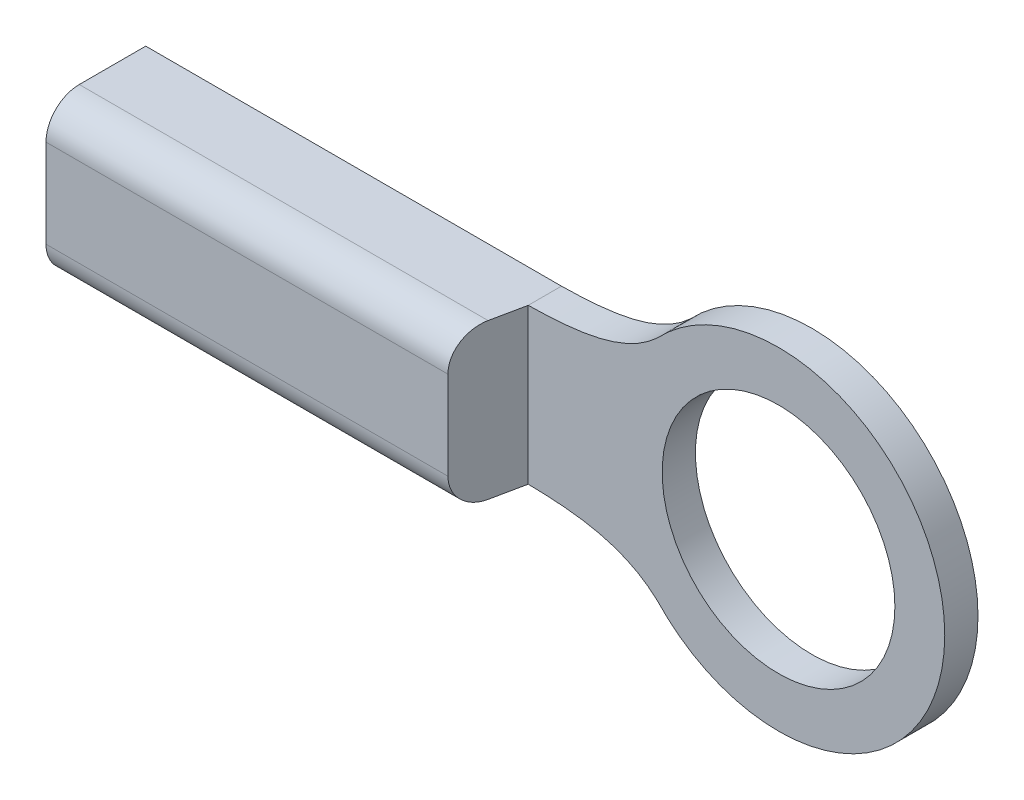
ISO-10303-21;
HEADER;
FILE_DESCRIPTION(('STEP AP214'),'2;1');
FILE_NAME('part.step','',(''),(''),'','','');
FILE_SCHEMA(('AUTOMOTIVE_DESIGN { 1 0 10303 214 1 1 1 1 }'));
ENDSEC;
DATA;
#1=APPLICATION_CONTEXT('core data for automotive mechanical design processes');
#2=APPLICATION_PROTOCOL_DEFINITION('international standard','automotive_design',2000,#1);
#3=PRODUCT_CONTEXT('',#1,'mechanical');
#4=PRODUCT('Part','Part','',(#3));
#5=PRODUCT_RELATED_PRODUCT_CATEGORY('part','',(#4));
#6=PRODUCT_DEFINITION_FORMATION('','',#4);
#7=PRODUCT_DEFINITION_CONTEXT('part definition',#1,'design');
#8=PRODUCT_DEFINITION('design','',#6,#7);
#9=PRODUCT_DEFINITION_SHAPE('','',#8);
#10=(LENGTH_UNIT() NAMED_UNIT(*) SI_UNIT(.MILLI.,.METRE.));
#11=(NAMED_UNIT(*) PLANE_ANGLE_UNIT() SI_UNIT($,.RADIAN.));
#12=(NAMED_UNIT(*) SI_UNIT($,.STERADIAN.) SOLID_ANGLE_UNIT());
#13=UNCERTAINTY_MEASURE_WITH_UNIT(LENGTH_MEASURE(1.E-05),#10,'distance_accuracy_value','');
#14=(GEOMETRIC_REPRESENTATION_CONTEXT(3) GLOBAL_UNCERTAINTY_ASSIGNED_CONTEXT((#13)) GLOBAL_UNIT_ASSIGNED_CONTEXT((#10,
#11,#12)) REPRESENTATION_CONTEXT('',''));
#15=CARTESIAN_POINT('',(0.,0.,0.));
#16=DIRECTION('',(0.,0.,1.));
#17=DIRECTION('',(1.,0.,0.));
#18=AXIS2_PLACEMENT_3D('',#15,#16,#17);
#19=CARTESIAN_POINT('',(0.,0.,0.5));
#20=DIRECTION('',(0.,0.,-1.));
#21=DIRECTION('',(-1.,0.,0.));
#22=AXIS2_PLACEMENT_3D('',#19,#20,#21);
#23=CYLINDRICAL_SURFACE('',#22,1.75);
#24=CARTESIAN_POINT('',(0.,0.,0.5));
#25=DIRECTION('',(0.,0.,1.));
#26=DIRECTION('',(1.,0.,0.));
#27=AXIS2_PLACEMENT_3D('',#24,#25,#26);
#28=CIRCLE('',#27,1.75);
#29=CARTESIAN_POINT('',(1.75,0.,0.5));
#30=VERTEX_POINT('',#29);
#31=EDGE_CURVE('E134',#30,#30,#28,.T.);
#32=ORIENTED_EDGE('',*,*,#31,.T.);
#33=EDGE_LOOP('',(#32));
#34=FACE_BOUND('',#33,.T.);
#35=CARTESIAN_POINT('',(0.,0.,0.));
#36=DIRECTION('',(0.,0.,1.));
#37=DIRECTION('',(1.,0.,0.));
#38=AXIS2_PLACEMENT_3D('',#35,#36,#37);
#39=CIRCLE('',#38,1.75);
#40=CARTESIAN_POINT('',(1.75,0.,0.));
#41=VERTEX_POINT('',#40);
#42=EDGE_CURVE('E148',#41,#41,#39,.T.);
#43=ORIENTED_EDGE('',*,*,#42,.F.);
#44=EDGE_LOOP('',(#43));
#45=FACE_BOUND('',#44,.T.);
#46=ADVANCED_FACE('F37',(#34,#45),#23,.F.);
#47=CARTESIAN_POINT('',(0.,0.,0.5));
#48=DIRECTION('',(0.,0.,-1.));
#49=DIRECTION('',(-1.,0.,0.));
#50=AXIS2_PLACEMENT_3D('',#47,#48,#49);
#51=CYLINDRICAL_SURFACE('',#50,2.5);
#52=CARTESIAN_POINT('',(0.,0.,0.5));
#53=DIRECTION('',(0.,0.,1.));
#54=DIRECTION('',(1.,0.,0.));
#55=AXIS2_PLACEMENT_3D('',#52,#53,#54);
#56=CIRCLE('',#55,2.5);
#57=CARTESIAN_POINT('',(-1.82422996137825,-1.70943998081533,0.5));
#58=VERTEX_POINT('',#57);
#59=CARTESIAN_POINT('',(-1.82422996137825,1.70943998081533,0.5));
#60=VERTEX_POINT('',#59);
#61=EDGE_CURVE('E116',#58,#60,#56,.T.);
#62=ORIENTED_EDGE('',*,*,#61,.F.);
#63=DIRECTION('',(0.,0.,-1.));
#64=VECTOR('',#63,1.);
#65=CARTESIAN_POINT('',(-1.82422996137825,-1.70943998081533,1.5));
#66=LINE('',#65,#64);
#67=CARTESIAN_POINT('',(-1.82422996137825,-1.70943998081533,0.));
#68=VERTEX_POINT('',#67);
#69=EDGE_CURVE('E129',#58,#68,#66,.T.);
#70=ORIENTED_EDGE('',*,*,#69,.T.);
#71=CARTESIAN_POINT('',(0.,0.,0.));
#72=DIRECTION('',(0.,0.,1.));
#73=DIRECTION('',(1.,0.,0.));
#74=AXIS2_PLACEMENT_3D('',#71,#72,#73);
#75=CIRCLE('',#74,2.5);
#76=CARTESIAN_POINT('',(-1.82422996137825,1.70943998081533,0.));
#77=VERTEX_POINT('',#76);
#78=EDGE_CURVE('E150',#68,#77,#75,.T.);
#79=ORIENTED_EDGE('',*,*,#78,.T.);
#80=DIRECTION('',(0.,0.,-1.));
#81=VECTOR('',#80,1.);
#82=CARTESIAN_POINT('',(-1.82422996137825,1.70943998081533,1.5));
#83=LINE('',#82,#81);
#84=EDGE_CURVE('E132',#60,#77,#83,.T.);
#85=ORIENTED_EDGE('',*,*,#84,.F.);
#86=EDGE_LOOP('',(#62,#70,#79,#85));
#87=FACE_BOUND('',#86,.T.);
#88=ADVANCED_FACE('F128',(#87),#51,.T.);
#89=CARTESIAN_POINT('',(0.,0.,0.5));
#90=DIRECTION('',(0.,0.,1.));
#91=DIRECTION('',(1.,0.,0.));
#92=AXIS2_PLACEMENT_3D('',#89,#90,#91);
#93=PLANE('',#92);
#94=ORIENTED_EDGE('',*,*,#61,.T.);
#95=CARTESIAN_POINT('',(-1.82422996137825,1.70943998081533,0.5));
#96=CARTESIAN_POINT('',(-2.34178439852012,1.22833040439289,0.5));
#97=CARTESIAN_POINT('',(-3.09851087389736,1.17900324339882,0.5));
#98=CARTESIAN_POINT('',(-3.76476193479,1.16483970754641,0.5));
#99=B_SPLINE_CURVE_WITH_KNOTS('',3,(#95,#96,#97,#98),.UNSPECIFIED.,.F.,.F.,(4,4),(0.,1.),.UNSPECIFIED.);
#100=CARTESIAN_POINT('',(-3.76476193479,1.16483970754641,0.5));
#101=VERTEX_POINT('',#100);
#102=EDGE_CURVE('E156',#101,#60,#99,.F.);
#103=ORIENTED_EDGE('',*,*,#102,.F.);
#104=DIRECTION('',(0.,1.,0.));
#105=VECTOR('',#104,1.);
#106=CARTESIAN_POINT('',(-3.76476193479,-2.5,0.5));
#107=LINE('',#106,#105);
#108=CARTESIAN_POINT('',(-3.76476193479,-1.16483970754641,0.5));
#109=VERTEX_POINT('',#108);
#110=EDGE_CURVE('E118',#109,#101,#107,.T.);
#111=ORIENTED_EDGE('',*,*,#110,.F.);
#112=CARTESIAN_POINT('',(-1.82422996137825,-1.70943998081533,0.5));
#113=CARTESIAN_POINT('',(-2.34178439852012,-1.22833040439289,0.5));
#114=CARTESIAN_POINT('',(-3.09851087389736,-1.17900324339882,0.5));
#115=CARTESIAN_POINT('',(-3.76476193479,-1.16483970754641,0.5));
#116=B_SPLINE_CURVE_WITH_KNOTS('',3,(#112,#113,#114,#115),.UNSPECIFIED.,.F.,.F.,(4,4),(0.,1.),.UNSPECIFIED.);
#117=EDGE_CURVE('E111',#109,#58,#116,.F.);
#118=ORIENTED_EDGE('',*,*,#117,.T.);
#119=EDGE_LOOP('',(#94,#103,#111,#118));
#120=FACE_BOUND('',#119,.T.);
#121=ORIENTED_EDGE('',*,*,#31,.F.);
#122=EDGE_LOOP('',(#121));
#123=FACE_BOUND('',#122,.T.);
#124=ADVANCED_FACE('F113',(#120,#123),#93,.T.);
#125=CARTESIAN_POINT('',(0.,0.,0.));
#126=DIRECTION('',(0.,0.,1.));
#127=DIRECTION('',(1.,0.,0.));
#128=AXIS2_PLACEMENT_3D('',#125,#126,#127);
#129=PLANE('',#128);
#130=ORIENTED_EDGE('',*,*,#42,.T.);
#131=EDGE_LOOP('',(#130));
#132=FACE_BOUND('',#131,.T.);
#133=ORIENTED_EDGE('',*,*,#78,.F.);
#134=CARTESIAN_POINT('',(-1.82422996137825,-1.70943998081533,0.));
#135=CARTESIAN_POINT('',(-2.34178439852012,-1.22833040439289,0.));
#136=CARTESIAN_POINT('',(-3.09851087389736,-1.17900324339882,0.));
#137=CARTESIAN_POINT('',(-3.76476193479,-1.16483970754641,0.));
#138=B_SPLINE_CURVE_WITH_KNOTS('',3,(#134,#135,#136,#137),.UNSPECIFIED.,.F.,.F.,(4,4),(0.,1.),.UNSPECIFIED.);
#139=CARTESIAN_POINT('',(-3.76476193479,-1.16483970754641,0.));
#140=VERTEX_POINT('',#139);
#141=EDGE_CURVE('E138',#68,#140,#138,.T.);
#142=ORIENTED_EDGE('',*,*,#141,.T.);
#143=DIRECTION('',(-1.,0.,0.));
#144=VECTOR('',#143,1.);
#145=CARTESIAN_POINT('',(0.,-1.16483970754641,0.));
#146=LINE('',#145,#144);
#147=CARTESIAN_POINT('',(-10.017195060379,-1.16483970754641,0.));
#148=VERTEX_POINT('',#147);
#149=EDGE_CURVE('E210',#140,#148,#146,.T.);
#150=ORIENTED_EDGE('',*,*,#149,.T.);
#151=DIRECTION('',(0.,-1.,0.));
#152=VECTOR('',#151,1.);
#153=CARTESIAN_POINT('',(-10.017195060379,0.,0.));
#154=LINE('',#153,#152);
#155=CARTESIAN_POINT('',(-10.017195060379,1.16483970754641,0.));
#156=VERTEX_POINT('',#155);
#157=EDGE_CURVE('E122',#156,#148,#154,.T.);
#158=ORIENTED_EDGE('',*,*,#157,.F.);
#159=DIRECTION('',(-1.,0.,0.));
#160=VECTOR('',#159,1.);
#161=CARTESIAN_POINT('',(0.,1.16483970754641,0.));
#162=LINE('',#161,#160);
#163=CARTESIAN_POINT('',(-3.76476193479,1.16483970754641,0.));
#164=VERTEX_POINT('',#163);
#165=EDGE_CURVE('E193',#164,#156,#162,.T.);
#166=ORIENTED_EDGE('',*,*,#165,.F.);
#167=CARTESIAN_POINT('',(-1.82422996137825,1.70943998081533,0.));
#168=CARTESIAN_POINT('',(-2.34178439852012,1.22833040439289,0.));
#169=CARTESIAN_POINT('',(-3.09851087389736,1.17900324339882,0.));
#170=CARTESIAN_POINT('',(-3.76476193479,1.16483970754641,0.));
#171=B_SPLINE_CURVE_WITH_KNOTS('',3,(#167,#168,#169,#170),.UNSPECIFIED.,.F.,.F.,(4,4),(0.,1.),.UNSPECIFIED.);
#172=EDGE_CURVE('E199',#77,#164,#171,.T.);
#173=ORIENTED_EDGE('',*,*,#172,.F.);
#174=EDGE_LOOP('',(#133,#142,#150,#158,#166,#173));
#175=FACE_BOUND('',#174,.T.);
#176=ADVANCED_FACE('F242',(#132,#175),#129,.F.);
#177=CARTESIAN_POINT('',(-10.017195060379,0.,1.5));
#178=DIRECTION('',(1.,0.,0.));
#179=DIRECTION('',(0.,0.,-1.));
#180=AXIS2_PLACEMENT_3D('',#177,#178,#179);
#181=PLANE('',#180);
#182=CARTESIAN_POINT('',(-10.017195060379,0.,0.793196725410894));
#183=DIRECTION('',(-1.,0.,0.));
#184=DIRECTION('',(0.,0.,1.));
#185=AXIS2_PLACEMENT_3D('',#182,#183,#184);
#186=CIRCLE('',#185,0.557530811457596);
#187=CARTESIAN_POINT('',(-10.017195060379,0.,1.35072753686849));
#188=VERTEX_POINT('',#187);
#189=EDGE_CURVE('E276',#188,#188,#186,.T.);
#190=ORIENTED_EDGE('',*,*,#189,.F.);
#191=EDGE_LOOP('',(#190));
#192=FACE_BOUND('',#191,.T.);
#193=DIRECTION('',(0.,-1.,0.));
#194=VECTOR('',#193,1.);
#195=CARTESIAN_POINT('',(-10.017195060379,0.,1.5));
#196=LINE('',#195,#194);
#197=CARTESIAN_POINT('',(-10.017195060379,0.664839707546408,1.5));
#198=VERTEX_POINT('',#197);
#199=CARTESIAN_POINT('',(-10.017195060379,-0.664839707546408,1.5));
#200=VERTEX_POINT('',#199);
#201=EDGE_CURVE('E190',#198,#200,#196,.T.);
#202=ORIENTED_EDGE('',*,*,#201,.F.);
#203=CARTESIAN_POINT('',(-10.017195060379,0.664839707546408,1.));
#204=DIRECTION('',(1.,0.,0.));
#205=DIRECTION('',(0.,0.,-1.));
#206=AXIS2_PLACEMENT_3D('',#203,#204,#205);
#207=CIRCLE('',#206,0.5);
#208=CARTESIAN_POINT('',(-10.017195060379,1.16483970754641,1.));
#209=VERTEX_POINT('',#208);
#210=EDGE_CURVE('E170',#198,#209,#207,.F.);
#211=ORIENTED_EDGE('',*,*,#210,.T.);
#212=DIRECTION('',(0.,0.,-1.));
#213=VECTOR('',#212,1.);
#214=CARTESIAN_POINT('',(-10.017195060379,1.16483970754641,1.5));
#215=LINE('',#214,#213);
#216=EDGE_CURVE('E188',#209,#156,#215,.T.);
#217=ORIENTED_EDGE('',*,*,#216,.T.);
#218=ORIENTED_EDGE('',*,*,#157,.T.);
#219=DIRECTION('',(0.,0.,-1.));
#220=VECTOR('',#219,1.);
#221=CARTESIAN_POINT('',(-10.017195060379,-1.16483970754641,1.5));
#222=LINE('',#221,#220);
#223=CARTESIAN_POINT('',(-10.017195060379,-1.16483970754641,1.));
#224=VERTEX_POINT('',#223);
#225=EDGE_CURVE('E141',#224,#148,#222,.T.);
#226=ORIENTED_EDGE('',*,*,#225,.F.);
#227=CARTESIAN_POINT('',(-10.017195060379,-0.664839707546408,1.));
#228=DIRECTION('',(1.,0.,0.));
#229=DIRECTION('',(0.,0.,-1.));
#230=AXIS2_PLACEMENT_3D('',#227,#228,#229);
#231=CIRCLE('',#230,0.5);
#232=EDGE_CURVE('E168',#224,#200,#231,.F.);
#233=ORIENTED_EDGE('',*,*,#232,.T.);
#234=EDGE_LOOP('',(#202,#211,#217,#218,#226,#233));
#235=FACE_BOUND('',#234,.T.);
#236=ADVANCED_FACE('F186',(#192,#235),#181,.F.);
#237=CARTESIAN_POINT('',(0.,-1.16483970754641,1.5));
#238=DIRECTION('',(0.,-1.,0.));
#239=DIRECTION('',(0.,0.,-1.));
#240=AXIS2_PLACEMENT_3D('',#237,#238,#239);
#241=PLANE('',#240);
#242=DIRECTION('',(0.202718340541204,0.,-0.979237087945621));
#243=VECTOR('',#242,1.);
#244=CARTESIAN_POINT('',(-3.80855939362616,-1.16483970754641,0.711564952315833));
#245=LINE('',#244,#243);
#246=CARTESIAN_POINT('',(-3.86827023887522,-1.16483970754641,1.));
#247=VERTEX_POINT('',#246);
#248=EDGE_CURVE('E123',#247,#109,#245,.T.);
#249=ORIENTED_EDGE('',*,*,#248,.F.);
#250=DIRECTION('',(-1.,0.,0.));
#251=VECTOR('',#250,1.);
#252=CARTESIAN_POINT('',(0.,-1.16483970754641,1.));
#253=LINE('',#252,#251);
#254=EDGE_CURVE('E11',#247,#224,#253,.T.);
#255=ORIENTED_EDGE('',*,*,#254,.T.);
#256=ORIENTED_EDGE('',*,*,#225,.T.);
#257=ORIENTED_EDGE('',*,*,#149,.F.);
#258=DIRECTION('',(0.,0.,-1.));
#259=VECTOR('',#258,1.);
#260=CARTESIAN_POINT('',(-3.76476193479,-1.16483970754641,1.5));
#261=LINE('',#260,#259);
#262=EDGE_CURVE('E139',#109,#140,#261,.T.);
#263=ORIENTED_EDGE('',*,*,#262,.F.);
#264=EDGE_LOOP('',(#249,#255,#256,#257,#263));
#265=FACE_BOUND('',#264,.T.);
#266=ADVANCED_FACE('F236',(#265),#241,.T.);
#267=CARTESIAN_POINT('',(-1.82422996137825,-1.70943998081533,1.5));
#268=CARTESIAN_POINT('',(-2.34178439852012,-1.22833040439289,1.5));
#269=CARTESIAN_POINT('',(-3.09851087389736,-1.17900324339882,1.5));
#270=CARTESIAN_POINT('',(-3.76476193479,-1.16483970754641,1.5));
#271=B_SPLINE_CURVE_WITH_KNOTS('',3,(#267,#268,#269,#270),.UNSPECIFIED.,.F.,.F.,(4,4),(0.,1.),.UNSPECIFIED.);
#272=DIRECTION('',(0.,0.,-1.));
#273=VECTOR('',#272,1.);
#274=SURFACE_OF_LINEAR_EXTRUSION('',#271,#273);
#275=ORIENTED_EDGE('',*,*,#117,.F.);
#276=ORIENTED_EDGE('',*,*,#262,.T.);
#277=ORIENTED_EDGE('',*,*,#141,.F.);
#278=ORIENTED_EDGE('',*,*,#69,.F.);
#279=EDGE_LOOP('',(#275,#276,#277,#278));
#280=FACE_BOUND('',#279,.T.);
#281=ADVANCED_FACE('F136',(#280),#274,.T.);
#282=CARTESIAN_POINT('',(-1.82422996137825,1.70943998081533,1.5));
#283=CARTESIAN_POINT('',(-2.34178439852012,1.22833040439289,1.5));
#284=CARTESIAN_POINT('',(-3.09851087389736,1.17900324339882,1.5));
#285=CARTESIAN_POINT('',(-3.76476193479,1.16483970754641,1.5));
#286=B_SPLINE_CURVE_WITH_KNOTS('',3,(#282,#283,#284,#285),.UNSPECIFIED.,.F.,.F.,(4,4),(0.,1.),.UNSPECIFIED.);
#287=DIRECTION('',(0.,0.,-1.));
#288=VECTOR('',#287,1.);
#289=SURFACE_OF_LINEAR_EXTRUSION('',#286,#288);
#290=DIRECTION('',(0.,0.,-1.));
#291=VECTOR('',#290,1.);
#292=CARTESIAN_POINT('',(-3.76476193479,1.16483970754641,1.5));
#293=LINE('',#292,#291);
#294=EDGE_CURVE('E143',#101,#164,#293,.T.);
#295=ORIENTED_EDGE('',*,*,#294,.F.);
#296=ORIENTED_EDGE('',*,*,#102,.T.);
#297=ORIENTED_EDGE('',*,*,#84,.T.);
#298=ORIENTED_EDGE('',*,*,#172,.T.);
#299=EDGE_LOOP('',(#295,#296,#297,#298));
#300=FACE_BOUND('',#299,.T.);
#301=ADVANCED_FACE('F228',(#300),#289,.F.);
#302=CARTESIAN_POINT('',(0.,1.16483970754641,1.5));
#303=DIRECTION('',(0.,-1.,0.));
#304=DIRECTION('',(0.,0.,-1.));
#305=AXIS2_PLACEMENT_3D('',#302,#303,#304);
#306=PLANE('',#305);
#307=ORIENTED_EDGE('',*,*,#216,.F.);
#308=DIRECTION('',(-1.,0.,0.));
#309=VECTOR('',#308,1.);
#310=CARTESIAN_POINT('',(-3.97177854296044,1.16483970754641,1.));
#311=LINE('',#310,#309);
#312=CARTESIAN_POINT('',(-3.86827023887522,1.16483970754641,1.));
#313=VERTEX_POINT('',#312);
#314=EDGE_CURVE('E60',#209,#313,#311,.F.);
#315=ORIENTED_EDGE('',*,*,#314,.T.);
#316=DIRECTION('',(0.202718340541204,0.,-0.979237087945621));
#317=VECTOR('',#316,1.);
#318=CARTESIAN_POINT('',(-3.80855939362616,1.16483970754641,0.711564952315833));
#319=LINE('',#318,#317);
#320=EDGE_CURVE('E176',#313,#101,#319,.T.);
#321=ORIENTED_EDGE('',*,*,#320,.T.);
#322=ORIENTED_EDGE('',*,*,#294,.T.);
#323=ORIENTED_EDGE('',*,*,#165,.T.);
#324=EDGE_LOOP('',(#307,#315,#321,#322,#323));
#325=FACE_BOUND('',#324,.T.);
#326=ADVANCED_FACE('F191',(#325),#306,.F.);
#327=CARTESIAN_POINT('',(0.,0.,1.5));
#328=DIRECTION('',(0.,0.,1.));
#329=DIRECTION('',(1.,0.,0.));
#330=AXIS2_PLACEMENT_3D('',#327,#328,#329);
#331=PLANE('',#330);
#332=DIRECTION('',(0.,-1.,0.));
#333=VECTOR('',#332,1.);
#334=CARTESIAN_POINT('',(-3.97177854296044,0.,1.5));
#335=LINE('',#334,#333);
#336=CARTESIAN_POINT('',(-3.97177854296044,0.664839707546408,1.5));
#337=VERTEX_POINT('',#336);
#338=CARTESIAN_POINT('',(-3.97177854296044,-0.664839707546408,1.5));
#339=VERTEX_POINT('',#338);
#340=EDGE_CURVE('E133',#337,#339,#335,.T.);
#341=ORIENTED_EDGE('',*,*,#340,.F.);
#342=DIRECTION('',(-1.,0.,0.));
#343=VECTOR('',#342,1.);
#344=CARTESIAN_POINT('',(-10.017195060379,0.664839707546408,1.5));
#345=LINE('',#344,#343);
#346=EDGE_CURVE('E165',#337,#198,#345,.T.);
#347=ORIENTED_EDGE('',*,*,#346,.T.);
#348=ORIENTED_EDGE('',*,*,#201,.T.);
#349=DIRECTION('',(-1.,0.,0.));
#350=VECTOR('',#349,1.);
#351=CARTESIAN_POINT('',(0.,-0.664839707546408,1.5));
#352=LINE('',#351,#350);
#353=EDGE_CURVE('E160',#200,#339,#352,.F.);
#354=ORIENTED_EDGE('',*,*,#353,.T.);
#355=EDGE_LOOP('',(#341,#347,#348,#354));
#356=FACE_BOUND('',#355,.T.);
#357=ADVANCED_FACE('F180',(#356),#331,.T.);
#358=CARTESIAN_POINT('',(-3.98693740142338,-2.5,1.57322532523796));
#359=DIRECTION('',(-0.979237087945621,0.,-0.202718340541204));
#360=DIRECTION('',(-0.202718340541204,0.,0.979237087945621));
#361=AXIS2_PLACEMENT_3D('',#358,#359,#360);
#362=PLANE('',#361);
#363=ORIENTED_EDGE('',*,*,#320,.F.);
#364=CARTESIAN_POINT('',(-3.86827023887522,0.664839707546408,1.));
#365=DIRECTION('',(-0.979237087945621,0.,-0.202718340541204));
#366=DIRECTION('',(0.202718340541204,0.,-0.979237087945621));
#367=AXIS2_PLACEMENT_3D('',#364,#365,#366);
#368=ELLIPSE('',#367,0.510601575609201,0.5);
#369=EDGE_CURVE('E45',#313,#337,#368,.F.);
#370=ORIENTED_EDGE('',*,*,#369,.T.);
#371=ORIENTED_EDGE('',*,*,#340,.T.);
#372=CARTESIAN_POINT('',(-3.86827023887522,-0.664839707546408,1.));
#373=DIRECTION('',(-0.979237087945621,0.,-0.202718340541204));
#374=DIRECTION('',(-0.202718340541204,0.,0.979237087945621));
#375=AXIS2_PLACEMENT_3D('',#372,#373,#374);
#376=ELLIPSE('',#375,0.510601575609201,0.5);
#377=EDGE_CURVE('E52',#339,#247,#376,.F.);
#378=ORIENTED_EDGE('',*,*,#377,.T.);
#379=ORIENTED_EDGE('',*,*,#248,.T.);
#380=ORIENTED_EDGE('',*,*,#110,.T.);
#381=EDGE_LOOP('',(#363,#370,#371,#378,#379,#380));
#382=FACE_BOUND('',#381,.T.);
#383=ADVANCED_FACE('F175',(#382),#362,.F.);
#384=CARTESIAN_POINT('',(0.,0.664839707546408,1.));
#385=DIRECTION('',(1.,0.,0.));
#386=DIRECTION('',(0.,0.,-1.));
#387=AXIS2_PLACEMENT_3D('',#384,#385,#386);
#388=CYLINDRICAL_SURFACE('',#387,0.5);
#389=ORIENTED_EDGE('',*,*,#369,.F.);
#390=ORIENTED_EDGE('',*,*,#314,.F.);
#391=ORIENTED_EDGE('',*,*,#210,.F.);
#392=ORIENTED_EDGE('',*,*,#346,.F.);
#393=EDGE_LOOP('',(#389,#390,#391,#392));
#394=FACE_BOUND('',#393,.T.);
#395=ADVANCED_FACE('F184',(#394),#388,.T.);
#396=CARTESIAN_POINT('',(0.,-0.664839707546408,1.));
#397=DIRECTION('',(-1.,0.,0.));
#398=DIRECTION('',(0.,0.,1.));
#399=AXIS2_PLACEMENT_3D('',#396,#397,#398);
#400=CYLINDRICAL_SURFACE('',#399,0.5);
#401=ORIENTED_EDGE('',*,*,#377,.F.);
#402=ORIENTED_EDGE('',*,*,#353,.F.);
#403=ORIENTED_EDGE('',*,*,#232,.F.);
#404=ORIENTED_EDGE('',*,*,#254,.F.);
#405=EDGE_LOOP('',(#401,#402,#403,#404));
#406=FACE_BOUND('',#405,.T.);
#407=ADVANCED_FACE('F39',(#406),#400,.T.);
#408=CARTESIAN_POINT('',(-9.91719506037898,0.,0.793196725410894));
#409=DIRECTION('',(-1.,0.,0.));
#410=DIRECTION('',(0.,0.,1.));
#411=AXIS2_PLACEMENT_3D('',#408,#409,#410);
#412=CYLINDRICAL_SURFACE('',#411,0.557530811457596);
#413=CARTESIAN_POINT('',(-9.91719506037898,0.,0.793196725410894));
#414=DIRECTION('',(-1.,0.,0.));
#415=DIRECTION('',(0.,0.,1.));
#416=AXIS2_PLACEMENT_3D('',#413,#414,#415);
#417=CIRCLE('',#416,0.557530811457596);
#418=CARTESIAN_POINT('',(-9.91719506037898,0.,1.35072753686849));
#419=VERTEX_POINT('',#418);
#420=EDGE_CURVE('E275',#419,#419,#417,.T.);
#421=ORIENTED_EDGE('',*,*,#420,.F.);
#422=EDGE_LOOP('',(#421));
#423=FACE_BOUND('',#422,.T.);
#424=ORIENTED_EDGE('',*,*,#189,.T.);
#425=EDGE_LOOP('',(#424));
#426=FACE_BOUND('',#425,.T.);
#427=ADVANCED_FACE('F258',(#423,#426),#412,.F.);
#428=CARTESIAN_POINT('',(-9.91719506037898,0.,0.793196725410894));
#429=DIRECTION('',(-1.,0.,0.));
#430=DIRECTION('',(0.,0.,1.));
#431=AXIS2_PLACEMENT_3D('',#428,#429,#430);
#432=PLANE('',#431);
#433=ORIENTED_EDGE('',*,*,#420,.T.);
#434=EDGE_LOOP('',(#433));
#435=FACE_BOUND('',#434,.T.);
#436=ADVANCED_FACE('F267',(#435),#432,.T.);
#437=CLOSED_SHELL('',(#46,#88,#124,#176,#236,#266,#281,#301,#326,#357,#383,#395,#407,#427,#436));
#438=MANIFOLD_SOLID_BREP('B2',#437);
#439=ADVANCED_BREP_SHAPE_REPRESENTATION('',(#18,#438),#14);
#440=SHAPE_DEFINITION_REPRESENTATION(#9,#439);
ENDSEC;
END-ISO-10303-21;
